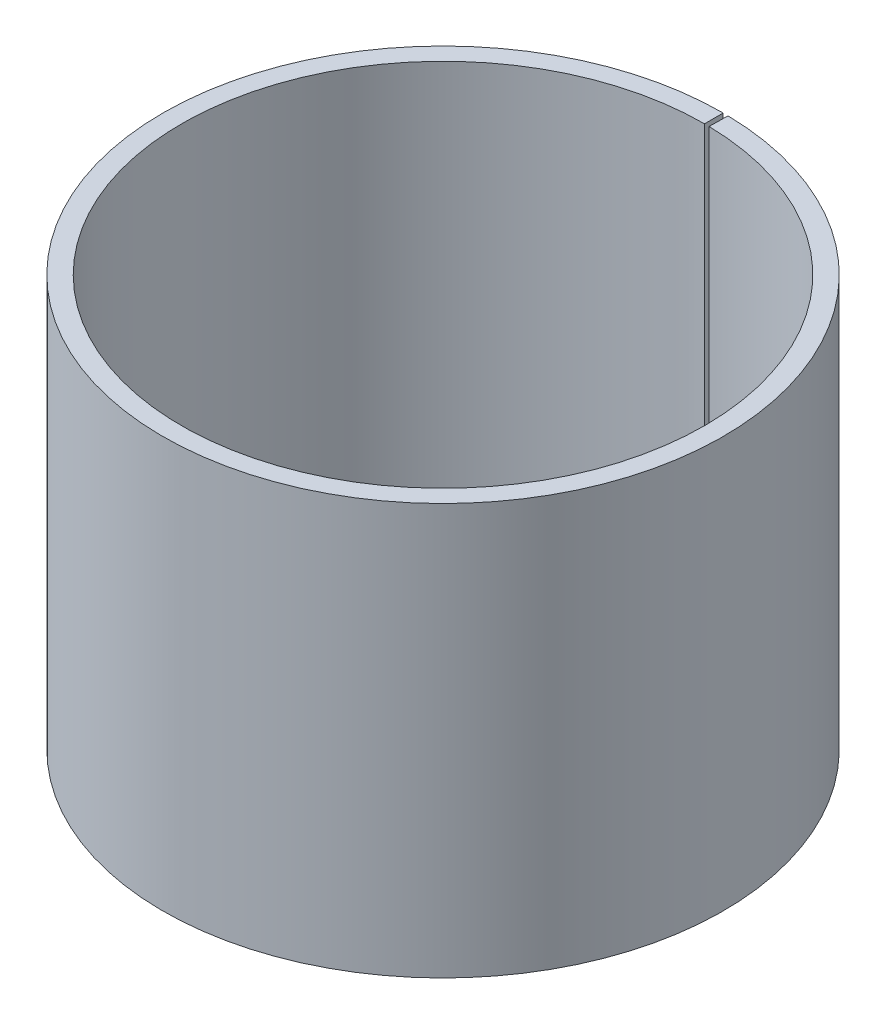
ISO-10303-21;
HEADER;
FILE_DESCRIPTION(('STEP AP214'),'2;1');
FILE_NAME('part.step','',(''),(''),'','','');
FILE_SCHEMA(('AUTOMOTIVE_DESIGN { 1 0 10303 214 1 1 1 1 }'));
ENDSEC;
DATA;
#1=APPLICATION_CONTEXT('core data for automotive mechanical design processes');
#2=APPLICATION_PROTOCOL_DEFINITION('international standard','automotive_design',2000,#1);
#3=PRODUCT_CONTEXT('',#1,'mechanical');
#4=PRODUCT('Part','Part','',(#3));
#5=PRODUCT_RELATED_PRODUCT_CATEGORY('part','',(#4));
#6=PRODUCT_DEFINITION_FORMATION('','',#4);
#7=PRODUCT_DEFINITION_CONTEXT('part definition',#1,'design');
#8=PRODUCT_DEFINITION('design','',#6,#7);
#9=PRODUCT_DEFINITION_SHAPE('','',#8);
#10=(LENGTH_UNIT() NAMED_UNIT(*) SI_UNIT(.MILLI.,.METRE.));
#11=(NAMED_UNIT(*) PLANE_ANGLE_UNIT() SI_UNIT($,.RADIAN.));
#12=(NAMED_UNIT(*) SI_UNIT($,.STERADIAN.) SOLID_ANGLE_UNIT());
#13=UNCERTAINTY_MEASURE_WITH_UNIT(LENGTH_MEASURE(1.E-05),#10,'distance_accuracy_value','');
#14=(GEOMETRIC_REPRESENTATION_CONTEXT(3) GLOBAL_UNCERTAINTY_ASSIGNED_CONTEXT((#13)) GLOBAL_UNIT_ASSIGNED_CONTEXT((#10,
#11,#12)) REPRESENTATION_CONTEXT('',''));
#15=CARTESIAN_POINT('',(0.,0.,0.));
#16=DIRECTION('',(0.,0.,1.));
#17=DIRECTION('',(1.,0.,0.));
#18=AXIS2_PLACEMENT_3D('',#15,#16,#17);
#19=CARTESIAN_POINT('',(0.,0.,0.));
#20=DIRECTION('',(0.,-1.,0.));
#21=DIRECTION('',(0.,0.,-1.));
#22=AXIS2_PLACEMENT_3D('',#19,#20,#21);
#23=CYLINDRICAL_SURFACE('',#22,114.3);
#24=CARTESIAN_POINT('',(0.,0.,0.));
#25=DIRECTION('',(0.,-1.,0.));
#26=DIRECTION('',(0.,0.,-1.));
#27=AXIS2_PLACEMENT_3D('',#24,#25,#26);
#28=CIRCLE('',#27,114.3);
#29=CARTESIAN_POINT('',(1.99481005577989,0.,-114.282591556376));
#30=VERTEX_POINT('',#29);
#31=CARTESIAN_POINT('',(0.,0.,-114.3));
#32=VERTEX_POINT('',#31);
#33=EDGE_CURVE('E11',#30,#32,#28,.T.);
#34=ORIENTED_EDGE('',*,*,#33,.F.);
#35=DIRECTION('',(0.,1.,0.));
#36=VECTOR('',#35,1.);
#37=CARTESIAN_POINT('',(1.99481005577989,0.,-114.282591556376));
#38=LINE('',#37,#36);
#39=CARTESIAN_POINT('',(1.99481005577989,167.64,-114.282591556376));
#40=VERTEX_POINT('',#39);
#41=EDGE_CURVE('E82',#30,#40,#38,.T.);
#42=ORIENTED_EDGE('',*,*,#41,.T.);
#43=CARTESIAN_POINT('',(0.,167.64,0.));
#44=DIRECTION('',(0.,-1.,0.));
#45=DIRECTION('',(0.,0.,-1.));
#46=AXIS2_PLACEMENT_3D('',#43,#44,#45);
#47=CIRCLE('',#46,114.3);
#48=CARTESIAN_POINT('',(0.,167.64,-114.3));
#49=VERTEX_POINT('',#48);
#50=EDGE_CURVE('E77',#40,#49,#47,.T.);
#51=ORIENTED_EDGE('',*,*,#50,.T.);
#52=DIRECTION('',(0.,1.,0.));
#53=VECTOR('',#52,1.);
#54=CARTESIAN_POINT('',(0.,0.,-114.3));
#55=LINE('',#54,#53);
#56=EDGE_CURVE('E80',#32,#49,#55,.T.);
#57=ORIENTED_EDGE('',*,*,#56,.F.);
#58=EDGE_LOOP('',(#34,#42,#51,#57));
#59=FACE_BOUND('',#58,.T.);
#60=ADVANCED_FACE('F41',(#59),#23,.T.);
#61=CARTESIAN_POINT('',(1.99481005577989,0.,-114.282591556376));
#62=DIRECTION('',(0.,1.,0.));
#63=DIRECTION('',(0.,0.,1.));
#64=AXIS2_PLACEMENT_3D('',#61,#62,#63);
#65=PLANE('',#64);
#66=CARTESIAN_POINT('',(0.,0.,0.));
#67=DIRECTION('',(0.,-1.,0.));
#68=DIRECTION('',(0.,0.,-1.));
#69=AXIS2_PLACEMENT_3D('',#66,#67,#68);
#70=CIRCLE('',#69,106.68);
#71=CARTESIAN_POINT('',(1.86182271872789,0.,-106.663752119284));
#72=VERTEX_POINT('',#71);
#73=CARTESIAN_POINT('',(0.,0.,-106.68));
#74=VERTEX_POINT('',#73);
#75=EDGE_CURVE('E49',#72,#74,#70,.T.);
#76=ORIENTED_EDGE('',*,*,#75,.F.);
#77=DIRECTION('',(-0.0174524064372693,0.,0.999847695156391));
#78=VECTOR('',#77,1.);
#79=CARTESIAN_POINT('',(1.99481005577989,0.,-114.282591556376));
#80=LINE('',#79,#78);
#81=EDGE_CURVE('E87',#30,#72,#80,.T.);
#82=ORIENTED_EDGE('',*,*,#81,.F.);
#83=ORIENTED_EDGE('',*,*,#33,.T.);
#84=DIRECTION('',(0.,0.,1.));
#85=VECTOR('',#84,1.);
#86=CARTESIAN_POINT('',(0.,0.,-114.3));
#87=LINE('',#86,#85);
#88=EDGE_CURVE('E99',#32,#74,#87,.T.);
#89=ORIENTED_EDGE('',*,*,#88,.T.);
#90=EDGE_LOOP('',(#76,#82,#83,#89));
#91=FACE_BOUND('',#90,.T.);
#92=ADVANCED_FACE('F43',(#91),#65,.F.);
#93=CARTESIAN_POINT('',(0.,0.,0.));
#94=DIRECTION('',(0.,-1.,0.));
#95=DIRECTION('',(0.,0.,-1.));
#96=AXIS2_PLACEMENT_3D('',#93,#94,#95);
#97=CYLINDRICAL_SURFACE('',#96,106.68);
#98=CARTESIAN_POINT('',(0.,167.64,0.));
#99=DIRECTION('',(0.,-1.,0.));
#100=DIRECTION('',(0.,0.,-1.));
#101=AXIS2_PLACEMENT_3D('',#98,#99,#100);
#102=CIRCLE('',#101,106.68);
#103=CARTESIAN_POINT('',(1.86182271872789,167.64,-106.663752119284));
#104=VERTEX_POINT('',#103);
#105=CARTESIAN_POINT('',(0.,167.64,-106.68));
#106=VERTEX_POINT('',#105);
#107=EDGE_CURVE('E86',#104,#106,#102,.T.);
#108=ORIENTED_EDGE('',*,*,#107,.F.);
#109=DIRECTION('',(0.,1.,0.));
#110=VECTOR('',#109,1.);
#111=CARTESIAN_POINT('',(1.86182271872789,0.,-106.663752119284));
#112=LINE('',#111,#110);
#113=EDGE_CURVE('E107',#72,#104,#112,.T.);
#114=ORIENTED_EDGE('',*,*,#113,.F.);
#115=ORIENTED_EDGE('',*,*,#75,.T.);
#116=DIRECTION('',(0.,1.,0.));
#117=VECTOR('',#116,1.);
#118=CARTESIAN_POINT('',(0.,0.,-106.68));
#119=LINE('',#118,#117);
#120=EDGE_CURVE('E95',#74,#106,#119,.T.);
#121=ORIENTED_EDGE('',*,*,#120,.T.);
#122=EDGE_LOOP('',(#108,#114,#115,#121));
#123=FACE_BOUND('',#122,.T.);
#124=ADVANCED_FACE('F113',(#123),#97,.F.);
#125=CARTESIAN_POINT('',(1.86182271872789,167.64,-106.663752119284));
#126=DIRECTION('',(0.,-1.,0.));
#127=DIRECTION('',(0.,0.,-1.));
#128=AXIS2_PLACEMENT_3D('',#125,#126,#127);
#129=PLANE('',#128);
#130=DIRECTION('',(0.0174524064372693,0.,-0.999847695156391));
#131=VECTOR('',#130,1.);
#132=CARTESIAN_POINT('',(1.86182271872789,167.64,-106.663752119284));
#133=LINE('',#132,#131);
#134=EDGE_CURVE('E105',#104,#40,#133,.T.);
#135=ORIENTED_EDGE('',*,*,#134,.F.);
#136=ORIENTED_EDGE('',*,*,#107,.T.);
#137=DIRECTION('',(0.,0.,-1.));
#138=VECTOR('',#137,1.);
#139=CARTESIAN_POINT('',(0.,167.64,-106.68));
#140=LINE('',#139,#138);
#141=EDGE_CURVE('E90',#106,#49,#140,.T.);
#142=ORIENTED_EDGE('',*,*,#141,.T.);
#143=ORIENTED_EDGE('',*,*,#50,.F.);
#144=EDGE_LOOP('',(#135,#136,#142,#143));
#145=FACE_BOUND('',#144,.T.);
#146=ADVANCED_FACE('F91',(#145),#129,.F.);
#147=CARTESIAN_POINT('',(0.,0.,0.));
#148=DIRECTION('',(-0.999847695156391,0.,-0.0174524064372693));
#149=DIRECTION('',(-0.0174524064372693,0.,0.999847695156391));
#150=AXIS2_PLACEMENT_3D('',#147,#148,#149);
#151=PLANE('',#150);
#152=ORIENTED_EDGE('',*,*,#41,.F.);
#153=ORIENTED_EDGE('',*,*,#81,.T.);
#154=ORIENTED_EDGE('',*,*,#113,.T.);
#155=ORIENTED_EDGE('',*,*,#134,.T.);
#156=EDGE_LOOP('',(#152,#153,#154,#155));
#157=FACE_BOUND('',#156,.T.);
#158=ADVANCED_FACE('F115',(#157),#151,.T.);
#159=CARTESIAN_POINT('',(0.,0.,0.));
#160=DIRECTION('',(-1.,0.,0.));
#161=DIRECTION('',(0.,0.,1.));
#162=AXIS2_PLACEMENT_3D('',#159,#160,#161);
#163=PLANE('',#162);
#164=ORIENTED_EDGE('',*,*,#56,.T.);
#165=ORIENTED_EDGE('',*,*,#141,.F.);
#166=ORIENTED_EDGE('',*,*,#120,.F.);
#167=ORIENTED_EDGE('',*,*,#88,.F.);
#168=EDGE_LOOP('',(#164,#165,#166,#167));
#169=FACE_BOUND('',#168,.T.);
#170=ADVANCED_FACE('F98',(#169),#163,.F.);
#171=CLOSED_SHELL('',(#60,#92,#124,#146,#158,#170));
#172=MANIFOLD_SOLID_BREP('B2',#171);
#173=ADVANCED_BREP_SHAPE_REPRESENTATION('',(#18,#172),#14);
#174=SHAPE_DEFINITION_REPRESENTATION(#9,#173);
ENDSEC;
END-ISO-10303-21;
